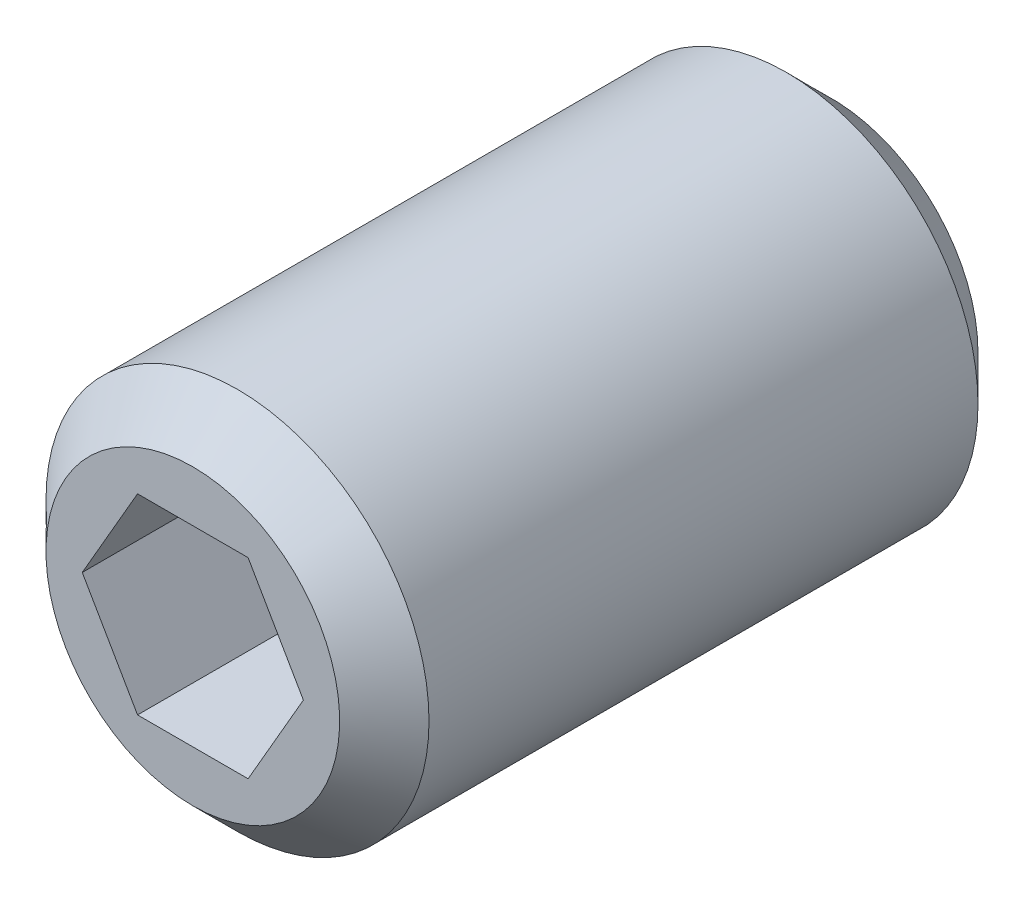
ISO-10303-21;
HEADER;
FILE_DESCRIPTION(('STEP AP214'),'2;1');
FILE_NAME('part.step','',(''),(''),'','','');
FILE_SCHEMA(('AUTOMOTIVE_DESIGN { 1 0 10303 214 1 1 1 1 }'));
ENDSEC;
DATA;
#1=APPLICATION_CONTEXT('core data for automotive mechanical design processes');
#2=APPLICATION_PROTOCOL_DEFINITION('international standard','automotive_design',2000,#1);
#3=PRODUCT_CONTEXT('',#1,'mechanical');
#4=PRODUCT('Part','Part','',(#3));
#5=PRODUCT_RELATED_PRODUCT_CATEGORY('part','',(#4));
#6=PRODUCT_DEFINITION_FORMATION('','',#4);
#7=PRODUCT_DEFINITION_CONTEXT('part definition',#1,'design');
#8=PRODUCT_DEFINITION('design','',#6,#7);
#9=PRODUCT_DEFINITION_SHAPE('','',#8);
#10=(LENGTH_UNIT() NAMED_UNIT(*) SI_UNIT(.MILLI.,.METRE.));
#11=(NAMED_UNIT(*) PLANE_ANGLE_UNIT() SI_UNIT($,.RADIAN.));
#12=(NAMED_UNIT(*) SI_UNIT($,.STERADIAN.) SOLID_ANGLE_UNIT());
#13=UNCERTAINTY_MEASURE_WITH_UNIT(LENGTH_MEASURE(1.E-05),#10,'distance_accuracy_value','');
#14=(GEOMETRIC_REPRESENTATION_CONTEXT(3) GLOBAL_UNCERTAINTY_ASSIGNED_CONTEXT((#13)) GLOBAL_UNIT_ASSIGNED_CONTEXT((#10,
#11,#12)) REPRESENTATION_CONTEXT('',''));
#15=CARTESIAN_POINT('',(0.,0.,0.));
#16=DIRECTION('',(0.,0.,1.));
#17=DIRECTION('',(1.,0.,0.));
#18=AXIS2_PLACEMENT_3D('',#15,#16,#17);
#19=CARTESIAN_POINT('',(-0.866025404,0.,3.));
#20=DIRECTION('',(-0.866025403730548,-0.500000000093341,0.));
#21=DIRECTION('',(0.500000000093341,-0.866025403730548,0.));
#22=AXIS2_PLACEMENT_3D('',#19,#20,#21);
#23=PLANE('',#22);
#24=DIRECTION('',(0.,0.,-1.));
#25=VECTOR('',#24,1.);
#26=CARTESIAN_POINT('',(-0.433012702,-0.75,4.));
#27=LINE('',#26,#25);
#28=CARTESIAN_POINT('',(-0.4330127017896,-0.7500000001347,5.));
#29=VERTEX_POINT('',#28);
#30=CARTESIAN_POINT('',(-0.433012702,-0.75,3.));
#31=VERTEX_POINT('',#30);
#32=EDGE_CURVE('E87',#29,#31,#27,.T.);
#33=ORIENTED_EDGE('',*,*,#32,.T.);
#34=DIRECTION('',(0.500000000093341,-0.866025403730548,0.));
#35=VECTOR('',#34,1.);
#36=CARTESIAN_POINT('',(-0.649519053,-0.375,3.));
#37=LINE('',#36,#35);
#38=CARTESIAN_POINT('',(-0.866025404,0.,3.));
#39=VERTEX_POINT('',#38);
#40=EDGE_CURVE('E58',#39,#31,#37,.T.);
#41=ORIENTED_EDGE('',*,*,#40,.F.);
#42=DIRECTION('',(0.,0.,1.));
#43=VECTOR('',#42,1.);
#44=CARTESIAN_POINT('',(-0.866025404,0.,4.));
#45=LINE('',#44,#43);
#46=CARTESIAN_POINT('',(-0.86602540399312,-2.90950044005284E-10,5.));
#47=VERTEX_POINT('',#46);
#48=EDGE_CURVE('E96',#39,#47,#45,.T.);
#49=ORIENTED_EDGE('',*,*,#48,.T.);
#50=DIRECTION('',(-0.500000000093341,0.866025403730548,0.));
#51=VECTOR('',#50,1.);
#52=CARTESIAN_POINT('',(-0.649519053,-0.375,5.));
#53=LINE('',#52,#51);
#54=EDGE_CURVE('E76',#29,#47,#53,.T.);
#55=ORIENTED_EDGE('',*,*,#54,.F.);
#56=EDGE_LOOP('',(#33,#41,#49,#55));
#57=FACE_BOUND('',#56,.T.);
#58=ADVANCED_FACE('F17',(#57),#23,.F.);
#59=CARTESIAN_POINT('',(-0.433012702,-0.75,3.));
#60=DIRECTION('',(0.,-1.,0.));
#61=DIRECTION('',(1.,0.,0.));
#62=AXIS2_PLACEMENT_3D('',#59,#60,#61);
#63=PLANE('',#62);
#64=DIRECTION('',(0.,0.,-1.));
#65=VECTOR('',#64,1.);
#66=CARTESIAN_POINT('',(0.433012702,-0.75,4.));
#67=LINE('',#66,#65);
#68=CARTESIAN_POINT('',(0.4330127017896,-0.7500000001347,5.));
#69=VERTEX_POINT('',#68);
#70=CARTESIAN_POINT('',(0.433012702,-0.75,3.));
#71=VERTEX_POINT('',#70);
#72=EDGE_CURVE('E92',#69,#71,#67,.T.);
#73=ORIENTED_EDGE('',*,*,#72,.T.);
#74=DIRECTION('',(1.,0.,0.));
#75=VECTOR('',#74,1.);
#76=CARTESIAN_POINT('',(0.,-0.75,3.));
#77=LINE('',#76,#75);
#78=EDGE_CURVE('E83',#31,#71,#77,.T.);
#79=ORIENTED_EDGE('',*,*,#78,.F.);
#80=ORIENTED_EDGE('',*,*,#32,.F.);
#81=DIRECTION('',(-1.,0.,0.));
#82=VECTOR('',#81,1.);
#83=CARTESIAN_POINT('',(0.,-0.75,5.));
#84=LINE('',#83,#82);
#85=EDGE_CURVE('E94',#69,#29,#84,.T.);
#86=ORIENTED_EDGE('',*,*,#85,.F.);
#87=EDGE_LOOP('',(#73,#79,#80,#86));
#88=FACE_BOUND('',#87,.T.);
#89=ADVANCED_FACE('F90',(#88),#63,.F.);
#90=CARTESIAN_POINT('',(-0.433012702,0.75,3.));
#91=DIRECTION('',(-0.866025403730548,0.500000000093341,0.));
#92=DIRECTION('',(-0.500000000093341,-0.866025403730548,0.));
#93=AXIS2_PLACEMENT_3D('',#90,#91,#92);
#94=PLANE('',#93);
#95=ORIENTED_EDGE('',*,*,#48,.F.);
#96=DIRECTION('',(-0.500000000093341,-0.866025403730548,0.));
#97=VECTOR('',#96,1.);
#98=CARTESIAN_POINT('',(-0.433012702,0.75,3.));
#99=LINE('',#98,#97);
#100=CARTESIAN_POINT('',(-0.433012702,0.75,3.));
#101=VERTEX_POINT('',#100);
#102=EDGE_CURVE('E21',#39,#101,#99,.F.);
#103=ORIENTED_EDGE('',*,*,#102,.T.);
#104=DIRECTION('',(0.,0.,1.));
#105=VECTOR('',#104,1.);
#106=CARTESIAN_POINT('',(-0.433012702,0.75,4.));
#107=LINE('',#106,#105);
#108=CARTESIAN_POINT('',(-0.4330127017896,0.7500000001347,5.));
#109=VERTEX_POINT('',#108);
#110=EDGE_CURVE('E106',#101,#109,#107,.T.);
#111=ORIENTED_EDGE('',*,*,#110,.T.);
#112=DIRECTION('',(0.500000000093341,0.866025403730548,0.));
#113=VECTOR('',#112,1.);
#114=CARTESIAN_POINT('',(-0.649519053,0.375,5.));
#115=LINE('',#114,#113);
#116=EDGE_CURVE('E68',#47,#109,#115,.T.);
#117=ORIENTED_EDGE('',*,*,#116,.F.);
#118=EDGE_LOOP('',(#95,#103,#111,#117));
#119=FACE_BOUND('',#118,.T.);
#120=ADVANCED_FACE('F136',(#119),#94,.F.);
#121=CARTESIAN_POINT('',(0.433012702,-0.75,3.));
#122=DIRECTION('',(0.866025403730548,-0.500000000093341,0.));
#123=DIRECTION('',(0.500000000093341,0.866025403730548,0.));
#124=AXIS2_PLACEMENT_3D('',#121,#122,#123);
#125=PLANE('',#124);
#126=DIRECTION('',(0.,0.,-1.));
#127=VECTOR('',#126,1.);
#128=CARTESIAN_POINT('',(0.866025404,0.,4.));
#129=LINE('',#128,#127);
#130=CARTESIAN_POINT('',(0.8660254041611,2.79033212009262E-10,5.));
#131=VERTEX_POINT('',#130);
#132=CARTESIAN_POINT('',(0.866025404,0.,3.));
#133=VERTEX_POINT('',#132);
#134=EDGE_CURVE('E105',#131,#133,#129,.T.);
#135=ORIENTED_EDGE('',*,*,#134,.T.);
#136=DIRECTION('',(0.500000000093341,0.866025403730548,0.));
#137=VECTOR('',#136,1.);
#138=CARTESIAN_POINT('',(0.433012702,-0.75,3.));
#139=LINE('',#138,#137);
#140=EDGE_CURVE('E116',#133,#71,#139,.F.);
#141=ORIENTED_EDGE('',*,*,#140,.T.);
#142=ORIENTED_EDGE('',*,*,#72,.F.);
#143=DIRECTION('',(-0.500000000093341,-0.866025403730548,0.));
#144=VECTOR('',#143,1.);
#145=CARTESIAN_POINT('',(0.649519053,-0.375,5.));
#146=LINE('',#145,#144);
#147=EDGE_CURVE('E103',#131,#69,#146,.T.);
#148=ORIENTED_EDGE('',*,*,#147,.F.);
#149=EDGE_LOOP('',(#135,#141,#142,#148));
#150=FACE_BOUND('',#149,.T.);
#151=ADVANCED_FACE('F134',(#150),#125,.F.);
#152=CARTESIAN_POINT('',(0.866025404,-0.75,3.));
#153=DIRECTION('',(0.,0.,-1.));
#154=DIRECTION('',(-1.,0.,0.));
#155=AXIS2_PLACEMENT_3D('',#152,#153,#154);
#156=PLANE('',#155);
#157=DIRECTION('',(-0.500000000093341,0.866025403730548,0.));
#158=VECTOR('',#157,1.);
#159=CARTESIAN_POINT('',(0.649519053,0.375,3.));
#160=LINE('',#159,#158);
#161=CARTESIAN_POINT('',(0.433012702,0.75,3.));
#162=VERTEX_POINT('',#161);
#163=EDGE_CURVE('E100',#133,#162,#160,.T.);
#164=ORIENTED_EDGE('',*,*,#163,.T.);
#165=DIRECTION('',(-1.,0.,0.));
#166=VECTOR('',#165,1.);
#167=CARTESIAN_POINT('',(0.,0.75,3.));
#168=LINE('',#167,#166);
#169=EDGE_CURVE('E117',#162,#101,#168,.T.);
#170=ORIENTED_EDGE('',*,*,#169,.T.);
#171=ORIENTED_EDGE('',*,*,#102,.F.);
#172=ORIENTED_EDGE('',*,*,#40,.T.);
#173=ORIENTED_EDGE('',*,*,#78,.T.);
#174=ORIENTED_EDGE('',*,*,#140,.F.);
#175=EDGE_LOOP('',(#164,#170,#171,#172,#173,#174));
#176=FACE_BOUND('',#175,.T.);
#177=ADVANCED_FACE('F80',(#176),#156,.F.);
#178=CARTESIAN_POINT('',(-0.433012702,0.75,3.));
#179=DIRECTION('',(0.,1.,0.));
#180=DIRECTION('',(0.,0.,1.));
#181=AXIS2_PLACEMENT_3D('',#178,#179,#180);
#182=PLANE('',#181);
#183=ORIENTED_EDGE('',*,*,#110,.F.);
#184=ORIENTED_EDGE('',*,*,#169,.F.);
#185=DIRECTION('',(0.,0.,1.));
#186=VECTOR('',#185,1.);
#187=CARTESIAN_POINT('',(0.433012702,0.75,4.));
#188=LINE('',#187,#186);
#189=CARTESIAN_POINT('',(0.433012701734738,0.75,5.));
#190=VERTEX_POINT('',#189);
#191=EDGE_CURVE('E107',#162,#190,#188,.T.);
#192=ORIENTED_EDGE('',*,*,#191,.T.);
#193=DIRECTION('',(1.,0.,0.));
#194=VECTOR('',#193,1.);
#195=CARTESIAN_POINT('',(0.,0.75,5.));
#196=LINE('',#195,#194);
#197=EDGE_CURVE('E36',#109,#190,#196,.T.);
#198=ORIENTED_EDGE('',*,*,#197,.F.);
#199=EDGE_LOOP('',(#183,#184,#192,#198));
#200=FACE_BOUND('',#199,.T.);
#201=ADVANCED_FACE('F129',(#200),#182,.F.);
#202=CARTESIAN_POINT('',(0.866025404,0.,3.));
#203=DIRECTION('',(0.866025403730548,0.500000000093341,0.));
#204=DIRECTION('',(-0.500000000093341,0.866025403730548,0.));
#205=AXIS2_PLACEMENT_3D('',#202,#203,#204);
#206=PLANE('',#205);
#207=ORIENTED_EDGE('',*,*,#191,.F.);
#208=ORIENTED_EDGE('',*,*,#163,.F.);
#209=ORIENTED_EDGE('',*,*,#134,.F.);
#210=DIRECTION('',(0.500000001110854,-0.866025403143087,0.));
#211=VECTOR('',#210,1.);
#212=CARTESIAN_POINT('',(0.4330127011584,0.7500000005388,5.));
#213=LINE('',#212,#211);
#214=EDGE_CURVE('E109',#190,#131,#213,.T.);
#215=ORIENTED_EDGE('',*,*,#214,.F.);
#216=EDGE_LOOP('',(#207,#208,#209,#215));
#217=FACE_BOUND('',#216,.T.);
#218=ADVANCED_FACE('F131',(#217),#206,.F.);
#219=CARTESIAN_POINT('',(-1.1638,-1.1638,5.));
#220=DIRECTION('',(0.,0.,1.));
#221=DIRECTION('',(1.,0.,0.));
#222=AXIS2_PLACEMENT_3D('',#219,#220,#221);
#223=PLANE('',#222);
#224=ORIENTED_EDGE('',*,*,#197,.T.);
#225=ORIENTED_EDGE('',*,*,#214,.T.);
#226=ORIENTED_EDGE('',*,*,#147,.T.);
#227=ORIENTED_EDGE('',*,*,#85,.T.);
#228=ORIENTED_EDGE('',*,*,#54,.T.);
#229=ORIENTED_EDGE('',*,*,#116,.T.);
#230=EDGE_LOOP('',(#224,#225,#226,#227,#228,#229));
#231=FACE_BOUND('',#230,.T.);
#232=CARTESIAN_POINT('',(0.,0.,4.99999999999989));
#233=DIRECTION('',(0.,0.,-1.));
#234=DIRECTION('',(0.,1.,0.));
#235=AXIS2_PLACEMENT_3D('',#232,#233,#234);
#236=CIRCLE('',#235,1.15000000000011);
#237=CARTESIAN_POINT('',(0.,1.15000000000011,4.99999999999989));
#238=VERTEX_POINT('',#237);
#239=EDGE_CURVE('E112',#238,#238,#236,.F.);
#240=ORIENTED_EDGE('',*,*,#239,.T.);
#241=EDGE_LOOP('',(#240));
#242=FACE_BOUND('',#241,.T.);
#243=ADVANCED_FACE('F132',(#231,#242),#223,.T.);
#244=CARTESIAN_POINT('',(0.,0.,5.));
#245=DIRECTION('',(0.,0.,-1.));
#246=DIRECTION('',(0.,1.,0.));
#247=AXIS2_PLACEMENT_3D('',#244,#245,#246);
#248=CONICAL_SURFACE('',#247,1.15,0.785398163397447);
#249=ORIENTED_EDGE('',*,*,#239,.F.);
#250=EDGE_LOOP('',(#249));
#251=FACE_BOUND('',#250,.T.);
#252=CARTESIAN_POINT('',(0.,0.,4.65));
#253=DIRECTION('',(0.,0.,-1.));
#254=DIRECTION('',(-1.,0.,0.));
#255=AXIS2_PLACEMENT_3D('',#252,#253,#254);
#256=CIRCLE('',#255,1.5);
#257=CARTESIAN_POINT('',(-1.5,0.,4.65));
#258=VERTEX_POINT('',#257);
#259=EDGE_CURVE('E115',#258,#258,#256,.F.);
#260=ORIENTED_EDGE('',*,*,#259,.T.);
#261=EDGE_LOOP('',(#260));
#262=FACE_BOUND('',#261,.T.);
#263=ADVANCED_FACE('F159',(#251,#262),#248,.T.);
#264=CARTESIAN_POINT('',(0.,0.,4.65));
#265=DIRECTION('',(0.,0.,-1.));
#266=DIRECTION('',(-1.,0.,0.));
#267=AXIS2_PLACEMENT_3D('',#264,#265,#266);
#268=CYLINDRICAL_SURFACE('',#267,1.5);
#269=CARTESIAN_POINT('',(0.,0.,0.349999999999961));
#270=DIRECTION('',(0.,0.,1.));
#271=DIRECTION('',(1.,0.,0.));
#272=AXIS2_PLACEMENT_3D('',#269,#270,#271);
#273=CIRCLE('',#272,1.5);
#274=CARTESIAN_POINT('',(1.5,0.,0.35));
#275=VERTEX_POINT('',#274);
#276=EDGE_CURVE('E27',#275,#275,#273,.T.);
#277=ORIENTED_EDGE('',*,*,#276,.T.);
#278=EDGE_LOOP('',(#277));
#279=FACE_BOUND('',#278,.T.);
#280=ORIENTED_EDGE('',*,*,#259,.F.);
#281=EDGE_LOOP('',(#280));
#282=FACE_BOUND('',#281,.T.);
#283=ADVANCED_FACE('F152',(#279,#282),#268,.T.);
#284=CARTESIAN_POINT('',(-1.1638,-1.1638,0.));
#285=DIRECTION('',(0.,0.,1.));
#286=DIRECTION('',(1.,0.,0.));
#287=AXIS2_PLACEMENT_3D('',#284,#285,#286);
#288=PLANE('',#287);
#289=CARTESIAN_POINT('',(0.,0.,0.));
#290=DIRECTION('',(0.,0.,1.));
#291=DIRECTION('',(1.,0.,0.));
#292=AXIS2_PLACEMENT_3D('',#289,#290,#291);
#293=CIRCLE('',#292,1.15);
#294=CARTESIAN_POINT('',(1.15,0.,0.));
#295=VERTEX_POINT('',#294);
#296=EDGE_CURVE('E11',#295,#295,#293,.F.);
#297=ORIENTED_EDGE('',*,*,#296,.T.);
#298=EDGE_LOOP('',(#297));
#299=FACE_BOUND('',#298,.T.);
#300=ADVANCED_FACE('F19',(#299),#288,.F.);
#301=CARTESIAN_POINT('',(0.,0.,0.));
#302=DIRECTION('',(0.,0.,1.));
#303=DIRECTION('',(1.,0.,0.));
#304=AXIS2_PLACEMENT_3D('',#301,#302,#303);
#305=CONICAL_SURFACE('',#304,1.15,0.785398163397448);
#306=ORIENTED_EDGE('',*,*,#296,.F.);
#307=EDGE_LOOP('',(#306));
#308=FACE_BOUND('',#307,.T.);
#309=ORIENTED_EDGE('',*,*,#276,.F.);
#310=EDGE_LOOP('',(#309));
#311=FACE_BOUND('',#310,.T.);
#312=ADVANCED_FACE('F145',(#308,#311),#305,.T.);
#313=CLOSED_SHELL('',(#58,#89,#120,#151,#177,#201,#218,#243,#263,#283,#300,#312));
#314=MANIFOLD_SOLID_BREP('B1',#313);
#315=ADVANCED_BREP_SHAPE_REPRESENTATION('',(#18,#314),#14);
#316=SHAPE_DEFINITION_REPRESENTATION(#9,#315);
ENDSEC;
END-ISO-10303-21;
